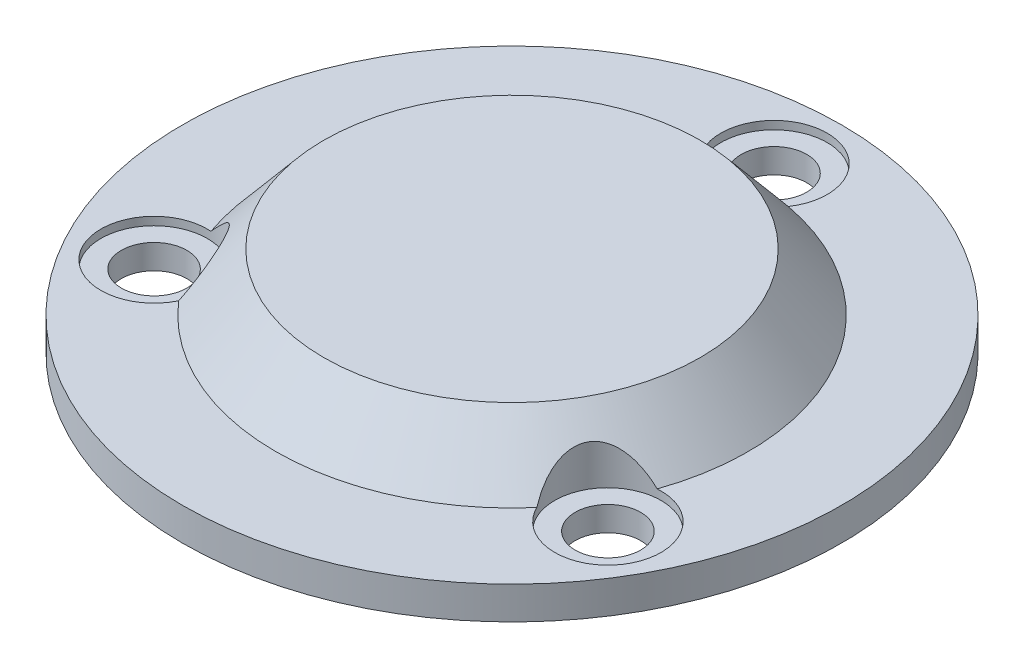
ISO-10303-21;
HEADER;
FILE_DESCRIPTION(('STEP AP214'),'2;1');
FILE_NAME('part.step','',(''),(''),'','','');
FILE_SCHEMA(('AUTOMOTIVE_DESIGN { 1 0 10303 214 1 1 1 1 }'));
ENDSEC;
DATA;
#1=APPLICATION_CONTEXT('core data for automotive mechanical design processes');
#2=APPLICATION_PROTOCOL_DEFINITION('international standard','automotive_design',2000,#1);
#3=PRODUCT_CONTEXT('',#1,'mechanical');
#4=PRODUCT('Part','Part','',(#3));
#5=PRODUCT_RELATED_PRODUCT_CATEGORY('part','',(#4));
#6=PRODUCT_DEFINITION_FORMATION('','',#4);
#7=PRODUCT_DEFINITION_CONTEXT('part definition',#1,'design');
#8=PRODUCT_DEFINITION('design','',#6,#7);
#9=PRODUCT_DEFINITION_SHAPE('','',#8);
#10=(LENGTH_UNIT() NAMED_UNIT(*) SI_UNIT(.MILLI.,.METRE.));
#11=(NAMED_UNIT(*) PLANE_ANGLE_UNIT() SI_UNIT($,.RADIAN.));
#12=(NAMED_UNIT(*) SI_UNIT($,.STERADIAN.) SOLID_ANGLE_UNIT());
#13=UNCERTAINTY_MEASURE_WITH_UNIT(LENGTH_MEASURE(1.E-05),#10,'distance_accuracy_value','');
#14=(GEOMETRIC_REPRESENTATION_CONTEXT(3) GLOBAL_UNCERTAINTY_ASSIGNED_CONTEXT((#13)) GLOBAL_UNIT_ASSIGNED_CONTEXT((#10,
#11,#12)) REPRESENTATION_CONTEXT('',''));
#15=CARTESIAN_POINT('',(0.,0.,0.));
#16=DIRECTION('',(0.,0.,1.));
#17=DIRECTION('',(1.,0.,0.));
#18=AXIS2_PLACEMENT_3D('',#15,#16,#17);
#19=CARTESIAN_POINT('',(0.,4.,0.));
#20=DIRECTION('',(0.,-1.,0.));
#21=DIRECTION('',(0.,0.,-1.));
#22=AXIS2_PLACEMENT_3D('',#19,#20,#21);
#23=CONICAL_SURFACE('',#22,22.9915332143791,0.698131700797729);
#24=CARTESIAN_POINT('',(0.,4.,0.));
#25=DIRECTION('',(0.,1.,0.));
#26=DIRECTION('',(0.,0.,1.));
#27=AXIS2_PLACEMENT_3D('',#24,#25,#26);
#28=CIRCLE('',#27,22.9915332143791);
#29=CARTESIAN_POINT('',(0.,4.,22.9915332143791));
#30=VERTEX_POINT('',#29);
#31=EDGE_CURVE('E80',#30,#30,#28,.T.);
#32=ORIENTED_EDGE('',*,*,#31,.F.);
#33=EDGE_LOOP('',(#32));
#34=FACE_BOUND('',#33,.T.);
#35=CARTESIAN_POINT('',(0.,-3.,0.));
#36=DIRECTION('',(0.,1.,0.));
#37=DIRECTION('',(0.,0.,1.));
#38=AXIS2_PLACEMENT_3D('',#35,#36,#37);
#39=CIRCLE('',#38,28.86523063262);
#40=CARTESIAN_POINT('',(-5.38426742507665,-3.,-28.3586178042866));
#41=VERTEX_POINT('',#40);
#42=CARTESIAN_POINT('',(-27.2514171472639,-3.,9.51639653125897));
#43=VERTEX_POINT('',#42);
#44=EDGE_CURVE('E71',#41,#43,#39,.T.);
#45=ORIENTED_EDGE('',*,*,#44,.T.);
#46=CARTESIAN_POINT('',(-28.3674083101256,-4.26464020688512,9.53304516200623));
#47=CARTESIAN_POINT('',(-28.276426053048,-4.15836582774383,9.52383802411035));
#48=CARTESIAN_POINT('',(-28.1849933470045,-4.05232236374394,9.51652030555505));
#49=CARTESIAN_POINT('',(-28.0012473833018,-3.84079081320335,9.50575011669946));
#50=CARTESIAN_POINT('',(-27.9089340631355,-3.73530276692426,9.50229792286963));
#51=CARTESIAN_POINT('',(-27.6296522186227,-3.41862031211702,9.49785379660031));
#52=CARTESIAN_POINT('',(-27.4413932919554,-3.20843752160533,9.50288294127843));
#53=CARTESIAN_POINT('',(-27.0667360681301,-2.79737210180176,9.5295334610195));
#54=CARTESIAN_POINT('',(-26.8804164844017,-2.59638971636689,9.55072040681778));
#55=CARTESIAN_POINT('',(-26.5050720084076,-2.1993790284019,9.61036065087066));
#56=CARTESIAN_POINT('',(-26.3160461464195,-2.00335257500208,9.64882029624996));
#57=CARTESIAN_POINT('',(-25.9361603611839,-1.61857214312343,9.74445888213441));
#58=CARTESIAN_POINT('',(-25.7453055766227,-1.42980266306422,9.8015951222856));
#59=CARTESIAN_POINT('',(-25.3620249649312,-1.06165836102233,9.93658096225799));
#60=CARTESIAN_POINT('',(-25.169600310559,-0.882277157192325,10.0144162667721));
#61=CARTESIAN_POINT('',(-24.7660225672919,-0.520102071360129,10.2016851304389));
#62=CARTESIAN_POINT('',(-24.5547905274695,-0.338539666160835,10.3133826352236));
#63=CARTESIAN_POINT('',(-24.1336564883917,0.00282684032135299,10.5685949873295));
#64=CARTESIAN_POINT('',(-23.9237537332971,0.162644612734362,10.7120896927537));
#65=CARTESIAN_POINT('',(-23.5411155577227,0.429015681360531,11.0103638945396));
#66=CARTESIAN_POINT('',(-23.3675820885006,0.539973062170191,11.1601091075028));
#67=CARTESIAN_POINT('',(-23.0293404687854,0.731489268579568,11.486681930907));
#68=CARTESIAN_POINT('',(-22.8646180467184,0.81209861317097,11.6634638383838));
#69=CARTESIAN_POINT('',(-22.5785611977636,0.923920891687245,12.0087109387845));
#70=CARTESIAN_POINT('',(-22.4547227232866,0.961372292830999,12.173055526795));
#71=CARTESIAN_POINT('',(-22.2217330145777,1.00692818740182,12.5156284354428));
#72=CARTESIAN_POINT('',(-22.1125720441243,1.0150522283196,12.6938474274424));
#73=CARTESIAN_POINT('',(-21.9124314335811,1.00115476983224,13.0590884856182));
#74=CARTESIAN_POINT('',(-21.8214537632654,0.979130006471208,13.246111502815));
#75=CARTESIAN_POINT('',(-21.659402819934,0.907092870982539,13.6233439314914));
#76=CARTESIAN_POINT('',(-21.5883453707507,0.85705834302277,13.8135557496404));
#77=CARTESIAN_POINT('',(-21.4474387517323,0.714201277627367,14.2500150323543));
#78=CARTESIAN_POINT('',(-21.3845187945461,0.612996555381667,14.495725360572));
#79=CARTESIAN_POINT('',(-21.2888583231161,0.379926367412418,14.9783779946829));
#80=CARTESIAN_POINT('',(-21.2561857217223,0.247992734197573,15.2152994288881));
#81=CARTESIAN_POINT('',(-21.2212848549463,-0.00458105832007092,15.6235803714685));
#82=CARTESIAN_POINT('',(-21.2137431487851,-0.120710874185286,15.7973721652305));
#83=CARTESIAN_POINT('',(-21.2120439392642,-0.363138681185438,16.137879214392));
#84=CARTESIAN_POINT('',(-21.2178942406565,-0.489442560295005,16.3045902855352));
#85=CARTESIAN_POINT('',(-21.2414427346962,-0.750050157074835,16.6310127612756));
#86=CARTESIAN_POINT('',(-21.2591547691989,-0.884363053736567,16.7907157556508));
#87=CARTESIAN_POINT('',(-21.3051469553955,-1.1591105358588,17.1030482081892));
#88=CARTESIAN_POINT('',(-21.3334249188559,-1.29954384844805,17.2556791236481));
#89=CARTESIAN_POINT('',(-21.4238799585214,-1.69069472150074,17.6643274481484));
#90=CARTESIAN_POINT('',(-21.4956761249397,-1.94635265120118,17.9135607721145));
#91=CARTESIAN_POINT('',(-21.6217564795988,-2.33684924212505,18.2726782156673));
#92=CARTESIAN_POINT('',(-21.6668312288329,-2.46814234506328,18.3898954268336));
#93=CARTESIAN_POINT('',(-21.7627704204398,-2.73275057942776,18.6196358450838));
#94=CARTESIAN_POINT('',(-21.8136356310286,-2.86606597711195,18.7321584266226));
#95=CARTESIAN_POINT('',(-21.994805954503,-3.3194955231395,19.1047728206892));
#96=CARTESIAN_POINT('',(-22.1378447217794,-3.64342970979444,19.354153432532));
#97=CARTESIAN_POINT('',(-22.4516089316416,-4.29675627597287,19.8275853736476));
#98=CARTESIAN_POINT('',(-22.6223607563035,-4.6261535853,20.0516122184641));
#99=CARTESIAN_POINT('',(-22.8975187393052,-5.12201492656997,20.3683507089587));
#100=CARTESIAN_POINT('',(-22.9924474771553,-5.28765637488683,20.4707467130131));
#101=CARTESIAN_POINT('',(-23.1884505429334,-5.61923448278426,20.669002052432));
#102=CARTESIAN_POINT('',(-23.2895249354063,-5.78517114544755,20.7648613191218));
#103=CARTESIAN_POINT('',(-23.4974476736313,-6.11675998061294,20.9497498594328));
#104=CARTESIAN_POINT('',(-23.6042861823071,-6.28241216925348,21.0387901787568));
#105=CARTESIAN_POINT('',(-23.8237274452137,-6.6134301663002,21.2100243315079));
#106=CARTESIAN_POINT('',(-23.9363300709475,-6.7787959810055,21.2922183174503));
#107=CARTESIAN_POINT('',(-24.0517359881804,-6.94388398042572,21.370895241136));
#108=B_SPLINE_CURVE_WITH_KNOTS('',3,(#46,#47,#48,#49,#50,#51,#52,#53,#54,#55,#56,#57,#58,#59,
#60,#61,#62,#63,#64,#65,#66,#67,#68,#69,#70,#71,#72,#73,#74,#75,#76,#77,#78,#79,#80,#81,#82,#83,
#84,#85,#86,#87,#88,#89,#90,#91,#92,#93,#94,#95,#96,#97,#98,#99,#100,#101,#102,#103,#104,#105,
#106,#107),.UNSPECIFIED.,.F.,.F.,(4,2,2,2,2,2,2,2,2,2,2,2,2,2,2,2,2,2,2,2,2,2,2,2,2,2,2,2,2,2,
4),(0.,0.420579236896307,0.841188552584911,1.6872652068447,2.51136236366432,3.33576259601512,
4.15829103076403,4.98025287482022,5.87858544890424,6.77635059382469,7.53759505637354,
8.29756664724598,8.92226576968056,9.54654843604196,10.1708986935504,10.7957435137749,
11.6104715098323,12.4270243679679,13.0536595571663,13.6806600371856,14.3083934630372,
14.9359969555398,16.0265338708143,16.5714732649629,17.1164850402306,18.4138428332383,
19.7124429988806,20.3622123015474,21.0119884296246,21.6606887167509,22.3093745489699),.UNSPECIFIED.);
#109=CARTESIAN_POINT('',(-21.8671497221859,-3.,18.8422212730307));
#110=VERTEX_POINT('',#109);
#111=EDGE_CURVE('E47',#43,#110,#108,.T.);
#112=ORIENTED_EDGE('',*,*,#111,.T.);
#113=CARTESIAN_POINT('',(21.8671497221893,-3.,18.8422212730268));
#114=VERTEX_POINT('',#113);
#115=EDGE_CURVE('E53',#110,#114,#39,.T.);
#116=ORIENTED_EDGE('',*,*,#115,.T.);
#117=CARTESIAN_POINT('',(21.8672296337352,-3.0002,18.8423856231038));
#118=CARTESIAN_POINT('',(21.8270913440078,-2.89974130950503,18.7598310930137));
#119=CARTESIAN_POINT('',(21.7884815558693,-2.79973901030024,18.6759880149452));
#120=CARTESIAN_POINT('',(21.714453830877,-2.60078646677593,18.5056576991601));
#121=CARTESIAN_POINT('',(21.6790363289353,-2.50183636742135,18.4191701033015));
#122=CARTESIAN_POINT('',(21.577620524894,-2.2063192768177,18.1552321063944));
#123=CARTESIAN_POINT('',(21.5166624031246,-2.01159268047443,17.9737214183943));
#124=CARTESIAN_POINT('',(21.408968119518,-1.62630643849747,17.5970101728006));
#125=CARTESIAN_POINT('',(21.3624321950427,-1.4358368369589,17.4016594782976));
#126=CARTESIAN_POINT('',(21.2868034383069,-1.06451708742264,16.9991431562968));
#127=CARTESIAN_POINT('',(21.2576897936195,-0.883655697992276,16.7919919509775));
#128=CARTESIAN_POINT('',(21.2179055796186,-0.519880732578358,16.346891215484));
#129=CARTESIAN_POINT('',(21.2090257546884,-0.338115110943773,16.1078229600718));
#130=CARTESIAN_POINT('',(21.2195452531679,0.00319953167335281,15.6154704471332));
#131=CARTESIAN_POINT('',(21.2388609964301,0.162812685038377,15.3622303368299));
#132=CARTESIAN_POINT('',(21.3058083990478,0.428999105248091,14.8820521587844));
#133=CARTESIAN_POINT('',(21.3487173606523,0.539942980839153,14.65692628124));
#134=CARTESIAN_POINT('',(21.46240946479,0.731467397235801,14.2007154838077));
#135=CARTESIAN_POINT('',(21.5331534365006,0.812090296749569,13.9696393626251));
#136=CARTESIAN_POINT('',(21.6891279026916,0.923919881238081,13.5492559541044));
#137=CARTESIAN_POINT('',(21.7695334009076,0.961370775732655,13.3598402783779));
#138=CARTESIAN_POINT('',(21.9497146074759,1.00692784215383,12.9867785973363));
#139=CARTESIAN_POINT('',(22.0494781588601,1.0150523687605,12.8031290545181));
#140=CARTESIAN_POINT('',(22.2657202307679,1.00115463401148,12.4471745208173));
#141=CARTESIAN_POINT('',(22.3822005487034,0.979129128701766,12.2748707527596));
#142=CARTESIAN_POINT('',(22.6278684377422,0.907090901867632,11.9459149190957));
#143=CARTESIAN_POINT('',(22.7570655080687,0.857057125803524,11.7892747327383));
#144=CARTESIAN_POINT('',(23.0646119254976,0.714193131712037,11.4489998999705));
#145=CARTESIAN_POINT('',(23.2459623502563,0.612976153740385,11.2716381027356));
#146=CARTESIAN_POINT('',(23.6161232037385,0.379899693344707,10.947473442239));
#147=CARTESIAN_POINT('',(23.8049480836104,0.247978177896749,10.800733598885));
#148=CARTESIAN_POINT('',(24.1409115060021,-0.00446954360105325,10.5664850768973));
#149=CARTESIAN_POINT('',(24.2874985504376,-0.120474590707647,10.4731445333457));
#150=CARTESIAN_POINT('',(24.5812384071822,-0.362636619170545,10.30156223337));
#151=CARTESIAN_POINT('',(24.7283915016201,-0.488799533290529,10.2233293926718));
#152=CARTESIAN_POINT('',(25.0228566505415,-0.749375200784125,10.0804559158921));
#153=CARTESIAN_POINT('',(25.1701676994535,-0.883813131914345,10.015859708889));
#154=CARTESIAN_POINT('',(25.4639610284776,-1.15883408806517,9.89937486482266));
#155=CARTESIAN_POINT('',(25.6104434953879,-1.29941566015241,9.84748324216464));
#156=CARTESIAN_POINT('',(25.8836766041887,-1.56719809391071,9.76124382916904));
#157=CARTESIAN_POINT('',(26.0105617822509,-1.69381964668561,9.72550275950733));
#158=CARTESIAN_POINT('',(26.263342074356,-1.95009221835616,9.66233451845889));
#159=CARTESIAN_POINT('',(26.3892371387537,-2.07974338788144,9.63490776140316));
#160=CARTESIAN_POINT('',(26.6385854029632,-2.3401205423786,9.58813873079076));
#161=CARTESIAN_POINT('',(26.7620503457176,-2.47082064751491,9.56871400209318));
#162=CARTESIAN_POINT('',(27.0077547433416,-2.73415529834523,9.53716882471472));
#163=CARTESIAN_POINT('',(27.1299946187311,-2.86678913900374,9.52504577885422));
#164=CARTESIAN_POINT('',(27.2515994343794,-3.0002,9.5163835616472));
#165=B_SPLINE_CURVE_WITH_KNOTS('',3,(#117,#118,#119,#120,#121,#122,#123,#124,#125,#126,#127,
#128,#129,#130,#131,#132,#133,#134,#135,#136,#137,#138,#139,#140,#141,#142,#143,#144,#145,#146,
#147,#148,#149,#150,#151,#152,#153,#154,#155,#156,#157,#158,#159,#160,#161,#162,#163,#164),
.UNSPECIFIED.,.F.,.F.,(4,2,2,2,2,2,2,2,2,2,2,2,2,2,2,2,2,2,2,2,2,2,2,4),(0.,0.408214964738593,
0.816485460268306,1.63508109552709,2.46457967657664,3.29308536110057,4.19246483547199,
5.08918368653363,5.85032532785218,6.61039966155916,7.23508607661022,7.85938144735025,
8.48374399362987,9.10857652084355,9.92338656803001,10.7398573058782,11.365856115756,
11.9922232338446,12.6206006340818,13.2488302227168,13.79695997138,14.3451170307581,
14.8874752197241,15.4296403799293),.UNSPECIFIED.);
#166=CARTESIAN_POINT('',(27.2514171472646,-3.,9.51639653125685));
#167=VERTEX_POINT('',#166);
#168=EDGE_CURVE('E98',#114,#167,#165,.T.);
#169=ORIENTED_EDGE('',*,*,#168,.T.);
#170=CARTESIAN_POINT('',(5.38426742507665,-3.,-28.3586178042866));
#171=VERTEX_POINT('',#170);
#172=EDGE_CURVE('E78',#167,#171,#39,.T.);
#173=ORIENTED_EDGE('',*,*,#172,.T.);
#174=CARTESIAN_POINT('',(5.3843698006455,-3.0002,-28.358769184754));
#175=CARTESIAN_POINT('',(5.33294462525366,-2.89974130950503,-28.2827311411405));
#176=CARTESIAN_POINT('',(5.27963928378408,-2.79973901030024,-28.2073725447436));
#177=CARTESIAN_POINT('',(5.16914276577578,-2.60078646677591,-28.0580974964233));
#178=CARTESIAN_POINT('',(5.11195106162087,-2.50183636742133,-27.984181242074));
#179=CARTESIAN_POINT('',(4.93408195329601,-2.20631927681767,-27.7643835809754));
#180=CARTESIAN_POINT('',(4.8073681473143,-2.01159268047438,-27.6208369549561));
#181=CARTESIAN_POINT('',(4.53497378054225,-1.62630643849739,-27.3392153467136));
#182=CARTESIAN_POINT('',(4.38906307869342,-1.4358368369588,-27.2012387066779));
#183=CARTESIAN_POINT('',(4.07828809677082,-1.0645170874225,-26.9344841210876));
#184=CARTESIAN_POINT('',(3.91344671288341,-0.883655697992117,-26.8056953625319));
#185=CARTESIAN_POINT('',(3.54787027570339,-0.519880732578081,-26.5486908547906));
#186=CARTESIAN_POINT('',(3.3452710057431,-0.338115110943406,-26.4214665731138));
#187=CARTESIAN_POINT('',(2.91362147268135,0.00319953167389733,-26.1844004695627));
#188=CARTESIAN_POINT('',(2.68465123227045,0.16281268503901,-26.0745083387691));
#189=CARTESIAN_POINT('',(2.23533103043122,0.428999105248885,-25.8923974011306));
#190=CARTESIAN_POINT('',(2.01891182062619,0.53994298084002,-25.8169947131578));
#191=CARTESIAN_POINT('',(1.56697562850024,0.731467397236809,-25.6873495648346));
#192=CARTESIAN_POINT('',(1.33148585149274,0.812090296750645,-25.6330775809092));
#193=CARTESIAN_POINT('',(0.889435907288843,0.923919881239272,-25.5579637267119));
#194=CARTESIAN_POINT('',(0.685194371126686,0.961370775733898,-25.5328890929077));
#195=CARTESIAN_POINT('',(0.272022874881985,1.00692784215517,-25.5023997545595));
#196=CARTESIAN_POINT('',(0.0630959297158933,1.01505236876189,-25.4969727530208));
#197=CARTESIAN_POINT('',(-0.35329077501513,1.00115463401295,-25.5062666138096));
#198=CARTESIAN_POINT('',(-0.560750374288697,0.979129128703291,-25.5209896441537));
#199=CARTESIAN_POINT('',(-0.968468427484161,0.907090901869239,-25.5692663601234));
#200=CARTESIAN_POINT('',(-1.16872134328647,0.857057125805165,-25.602834211942));
#201=CARTESIAN_POINT('',(-1.61718120144633,0.714193131713773,-25.6990398058944));
#202=CARTESIAN_POINT('',(-1.86145623589189,0.612976153742192,-25.7674129821051));
#203=CARTESIAN_POINT('',(-2.3272714936322,0.379899693346648,-25.9258993544588));
#204=CARTESIAN_POINT('',(-2.54876436566001,0.247978177898754,-26.0160565756174));
#205=CARTESIAN_POINT('',(-2.91961124769614,-0.00446954359892481,-26.1898851731571));
#206=CARTESIAN_POINT('',(-3.07374005183261,-0.120474590705458,-26.270163005728));
#207=CARTESIAN_POINT('',(-3.36920461082352,-0.36263661916823,-26.4387580337849));
#208=CARTESIAN_POINT('',(-3.51053278549731,-0.488799533288149,-26.5270799314645));
#209=CARTESIAN_POINT('',(-3.78149742037624,-0.749375200781619,-26.7106574925697));
#210=CARTESIAN_POINT('',(-3.91109490108504,-0.883813131911779,-26.805934499684));
#211=CARTESIAN_POINT('',(-4.15887039971439,-1.15883408806248,-27.002124564048));
#212=CARTESIAN_POINT('',(-4.27705109663495,-1.29941566014965,-27.1030362902723));
#213=CARTESIAN_POINT('',(-4.48835317349721,-1.56719809390811,-27.2965433971511));
#214=CARTESIAN_POINT('',(-4.58274843681396,-1.69381964668323,-27.388558649886));
#215=CARTESIAN_POINT('',(-4.76384388432719,-1.95009221835424,-27.5758886839012));
#216=CARTESIAN_POINT('',(-4.85054368487991,-2.07974338787976,-27.671203629353));
#217=CARTESIAN_POINT('',(-5.01572098560564,-2.34012054237739,-27.8637610452421));
#218=CARTESIAN_POINT('',(-5.09427576549668,-2.47082064751393,-27.9609724577956));
#219=CARTESIAN_POINT('',(-5.24444688928558,-2.73415529834474,-28.1579861192707));
#220=CARTESIAN_POINT('',(-5.31606569266688,-2.86678913900349,-28.2577874337834));
#221=CARTESIAN_POINT('',(-5.3843698006455,-3.0002,-28.358769184754));
#222=B_SPLINE_CURVE_WITH_KNOTS('',3,(#174,#175,#176,#177,#178,#179,#180,#181,#182,#183,#184,
#185,#186,#187,#188,#189,#190,#191,#192,#193,#194,#195,#196,#197,#198,#199,#200,#201,#202,#203,
#204,#205,#206,#207,#208,#209,#210,#211,#212,#213,#214,#215,#216,#217,#218,#219,#220,#221),
.UNSPECIFIED.,.F.,.F.,(4,2,2,2,2,2,2,2,2,2,2,2,2,2,2,2,2,2,2,2,2,2,2,4),(0.,0.408214964738593,
0.816485460268306,1.63508109552708,2.46457967657662,3.29308536110055,4.19246483547222,
5.08918368653411,5.85032532785284,6.61039966156,7.23508607661108,7.85938144735114,
8.48374399363079,9.10857652084452,9.92338656803079,10.7398573058788,11.3658561157564,
11.9922232338448,12.6206006340818,13.2488302227166,13.7969599713808,14.3451170307599,
14.8874752197269,15.429640379933),.UNSPECIFIED.);
#223=EDGE_CURVE('E91',#171,#41,#222,.T.);
#224=ORIENTED_EDGE('',*,*,#223,.T.);
#225=EDGE_LOOP('',(#45,#112,#116,#169,#173,#224));
#226=FACE_BOUND('',#225,.T.);
#227=ADVANCED_FACE('F33',(#34,#226),#23,.T.);
#228=CARTESIAN_POINT('',(-28.86523063262,-3.,0.));
#229=DIRECTION('',(0.,1.,0.));
#230=DIRECTION('',(0.,0.,1.));
#231=AXIS2_PLACEMENT_3D('',#228,#229,#230);
#232=PLANE('',#231);
#233=CARTESIAN_POINT('',(0.,-3.,0.));
#234=DIRECTION('',(0.,1.,0.));
#235=DIRECTION('',(0.,0.,1.));
#236=AXIS2_PLACEMENT_3D('',#233,#234,#235);
#237=CIRCLE('',#236,40.25);
#238=CARTESIAN_POINT('',(0.,-3.,40.25));
#239=VERTEX_POINT('',#238);
#240=EDGE_CURVE('E81',#239,#239,#237,.T.);
#241=ORIENTED_EDGE('',*,*,#240,.T.);
#242=EDGE_LOOP('',(#241));
#243=FACE_BOUND('',#242,.T.);
#244=ORIENTED_EDGE('',*,*,#115,.F.);
#245=CARTESIAN_POINT('',(-27.7128129211,-3.,16.0000000000012));
#246=DIRECTION('',(0.,1.,0.));
#247=DIRECTION('',(0.,0.,1.));
#248=AXIS2_PLACEMENT_3D('',#245,#246,#247);
#249=CIRCLE('',#248,6.5);
#250=EDGE_CURVE('E11',#110,#43,#249,.F.);
#251=ORIENTED_EDGE('',*,*,#250,.T.);
#252=ORIENTED_EDGE('',*,*,#44,.F.);
#253=CARTESIAN_POINT('',(0.,-3.,-32.));
#254=DIRECTION('',(0.,1.,0.));
#255=DIRECTION('',(0.,0.,1.));
#256=AXIS2_PLACEMENT_3D('',#253,#254,#255);
#257=CIRCLE('',#256,6.5);
#258=EDGE_CURVE('E87',#41,#171,#257,.F.);
#259=ORIENTED_EDGE('',*,*,#258,.T.);
#260=ORIENTED_EDGE('',*,*,#172,.F.);
#261=CARTESIAN_POINT('',(27.7128129211041,-3.,15.9999999999988));
#262=DIRECTION('',(0.,1.,0.));
#263=DIRECTION('',(0.,0.,1.));
#264=AXIS2_PLACEMENT_3D('',#261,#262,#263);
#265=CIRCLE('',#264,6.5);
#266=EDGE_CURVE('E41',#167,#114,#265,.F.);
#267=ORIENTED_EDGE('',*,*,#266,.T.);
#268=EDGE_LOOP('',(#244,#251,#252,#259,#260,#267));
#269=FACE_BOUND('',#268,.T.);
#270=ADVANCED_FACE('F76',(#243,#269),#232,.T.);
#271=CARTESIAN_POINT('',(-27.7128129211,-7.,16.0000000000012));
#272=DIRECTION('',(0.,1.,0.));
#273=DIRECTION('',(0.,0.,1.));
#274=AXIS2_PLACEMENT_3D('',#271,#272,#273);
#275=CYLINDRICAL_SURFACE('',#274,4.00000000000259);
#276=CARTESIAN_POINT('',(-27.7128129211,-7.,16.0000000000012));
#277=DIRECTION('',(0.,1.,0.));
#278=DIRECTION('',(0.,0.,1.));
#279=AXIS2_PLACEMENT_3D('',#276,#277,#278);
#280=CIRCLE('',#279,4.00000000000259);
#281=CARTESIAN_POINT('',(-27.7128129211,-7.,20.0000000000038));
#282=VERTEX_POINT('',#281);
#283=EDGE_CURVE('E143',#282,#282,#280,.T.);
#284=ORIENTED_EDGE('',*,*,#283,.F.);
#285=EDGE_LOOP('',(#284));
#286=FACE_BOUND('',#285,.T.);
#287=CARTESIAN_POINT('',(-27.7128129211,-4.,16.0000000000012));
#288=DIRECTION('',(0.,1.,0.));
#289=DIRECTION('',(0.,0.,1.));
#290=AXIS2_PLACEMENT_3D('',#287,#288,#289);
#291=CIRCLE('',#290,4.00000000000259);
#292=CARTESIAN_POINT('',(-27.7128129211,-4.,20.0000000000038));
#293=VERTEX_POINT('',#292);
#294=EDGE_CURVE('E73',#293,#293,#291,.F.);
#295=ORIENTED_EDGE('',*,*,#294,.F.);
#296=EDGE_LOOP('',(#295));
#297=FACE_BOUND('',#296,.T.);
#298=ADVANCED_FACE('F149',(#286,#297),#275,.F.);
#299=CARTESIAN_POINT('',(27.7128129211041,-7.,15.9999999999988));
#300=DIRECTION('',(0.,1.,0.));
#301=DIRECTION('',(0.,0.,1.));
#302=AXIS2_PLACEMENT_3D('',#299,#300,#301);
#303=CYLINDRICAL_SURFACE('',#302,4.00000000000176);
#304=CARTESIAN_POINT('',(27.7128129211041,-7.,15.9999999999988));
#305=DIRECTION('',(0.,1.,0.));
#306=DIRECTION('',(0.,0.,1.));
#307=AXIS2_PLACEMENT_3D('',#304,#305,#306);
#308=CIRCLE('',#307,4.00000000000176);
#309=CARTESIAN_POINT('',(27.7128129211041,-7.,20.0000000000006));
#310=VERTEX_POINT('',#309);
#311=EDGE_CURVE('E194',#310,#310,#308,.T.);
#312=ORIENTED_EDGE('',*,*,#311,.F.);
#313=EDGE_LOOP('',(#312));
#314=FACE_BOUND('',#313,.T.);
#315=CARTESIAN_POINT('',(27.7128129211041,-4.,15.9999999999988));
#316=DIRECTION('',(0.,1.,0.));
#317=DIRECTION('',(0.,0.,1.));
#318=AXIS2_PLACEMENT_3D('',#315,#316,#317);
#319=CIRCLE('',#318,4.00000000000176);
#320=CARTESIAN_POINT('',(27.7128129211041,-4.,20.0000000000006));
#321=VERTEX_POINT('',#320);
#322=EDGE_CURVE('E95',#321,#321,#319,.F.);
#323=ORIENTED_EDGE('',*,*,#322,.F.);
#324=EDGE_LOOP('',(#323));
#325=FACE_BOUND('',#324,.T.);
#326=ADVANCED_FACE('F152',(#314,#325),#303,.F.);
#327=CARTESIAN_POINT('',(0.,-7.,-32.));
#328=DIRECTION('',(0.,1.,0.));
#329=DIRECTION('',(0.,0.,1.));
#330=AXIS2_PLACEMENT_3D('',#327,#328,#329);
#331=CYLINDRICAL_SURFACE('',#330,4.);
#332=CARTESIAN_POINT('',(0.,-7.,-32.));
#333=DIRECTION('',(0.,1.,0.));
#334=DIRECTION('',(0.,0.,1.));
#335=AXIS2_PLACEMENT_3D('',#332,#333,#334);
#336=CIRCLE('',#335,4.);
#337=CARTESIAN_POINT('',(0.,-7.,-28.));
#338=VERTEX_POINT('',#337);
#339=EDGE_CURVE('E192',#338,#338,#336,.T.);
#340=ORIENTED_EDGE('',*,*,#339,.F.);
#341=EDGE_LOOP('',(#340));
#342=FACE_BOUND('',#341,.T.);
#343=CARTESIAN_POINT('',(0.,-4.,-32.));
#344=DIRECTION('',(0.,1.,0.));
#345=DIRECTION('',(0.,0.,1.));
#346=AXIS2_PLACEMENT_3D('',#343,#344,#345);
#347=CIRCLE('',#346,4.);
#348=CARTESIAN_POINT('',(0.,-4.,-28.));
#349=VERTEX_POINT('',#348);
#350=EDGE_CURVE('E88',#349,#349,#347,.F.);
#351=ORIENTED_EDGE('',*,*,#350,.F.);
#352=EDGE_LOOP('',(#351));
#353=FACE_BOUND('',#352,.T.);
#354=ADVANCED_FACE('F156',(#342,#353),#331,.F.);
#355=CARTESIAN_POINT('',(-21.1263025817591,0.,0.));
#356=DIRECTION('',(0.,-1.,0.));
#357=DIRECTION('',(0.,0.,-1.));
#358=AXIS2_PLACEMENT_3D('',#355,#356,#357);
#359=PLANE('',#358);
#360=CARTESIAN_POINT('',(0.,0.,0.));
#361=DIRECTION('',(0.,1.,0.));
#362=DIRECTION('',(0.,0.,1.));
#363=AXIS2_PLACEMENT_3D('',#360,#361,#362);
#364=CIRCLE('',#363,21.1263025817591);
#365=CARTESIAN_POINT('',(0.,0.,21.1263025817591));
#366=VERTEX_POINT('',#365);
#367=EDGE_CURVE('E187',#366,#366,#364,.T.);
#368=ORIENTED_EDGE('',*,*,#367,.F.);
#369=EDGE_LOOP('',(#368));
#370=FACE_BOUND('',#369,.T.);
#371=ADVANCED_FACE('F35',(#370),#359,.T.);
#372=CARTESIAN_POINT('',(0.,4.,0.));
#373=DIRECTION('',(0.,1.,0.));
#374=DIRECTION('',(0.,0.,1.));
#375=AXIS2_PLACEMENT_3D('',#372,#373,#374);
#376=PLANE('',#375);
#377=ORIENTED_EDGE('',*,*,#31,.T.);
#378=EDGE_LOOP('',(#377));
#379=FACE_BOUND('',#378,.T.);
#380=ADVANCED_FACE('F171',(#379),#376,.T.);
#381=CARTESIAN_POINT('',(0.,4.00000000000001,0.));
#382=DIRECTION('',(0.,1.,0.));
#383=DIRECTION('',(0.,0.,1.));
#384=AXIS2_PLACEMENT_3D('',#381,#382,#383);
#385=CYLINDRICAL_SURFACE('',#384,40.25);
#386=CARTESIAN_POINT('',(0.,-7.,0.));
#387=DIRECTION('',(0.,1.,0.));
#388=DIRECTION('',(0.,0.,1.));
#389=AXIS2_PLACEMENT_3D('',#386,#387,#388);
#390=CIRCLE('',#389,40.25);
#391=CARTESIAN_POINT('',(0.,-7.,40.25));
#392=VERTEX_POINT('',#391);
#393=EDGE_CURVE('E182',#392,#392,#390,.T.);
#394=ORIENTED_EDGE('',*,*,#393,.T.);
#395=EDGE_LOOP('',(#394));
#396=FACE_BOUND('',#395,.T.);
#397=ORIENTED_EDGE('',*,*,#240,.F.);
#398=EDGE_LOOP('',(#397));
#399=FACE_BOUND('',#398,.T.);
#400=ADVANCED_FACE('F168',(#396,#399),#385,.T.);
#401=CARTESIAN_POINT('',(-40.25,-7.,0.));
#402=DIRECTION('',(0.,-1.,0.));
#403=DIRECTION('',(0.,0.,-1.));
#404=AXIS2_PLACEMENT_3D('',#401,#402,#403);
#405=PLANE('',#404);
#406=ORIENTED_EDGE('',*,*,#283,.T.);
#407=EDGE_LOOP('',(#406));
#408=FACE_BOUND('',#407,.T.);
#409=ORIENTED_EDGE('',*,*,#311,.T.);
#410=EDGE_LOOP('',(#409));
#411=FACE_BOUND('',#410,.T.);
#412=ORIENTED_EDGE('',*,*,#339,.T.);
#413=EDGE_LOOP('',(#412));
#414=FACE_BOUND('',#413,.T.);
#415=CARTESIAN_POINT('',(0.,-7.,0.));
#416=DIRECTION('',(0.,1.,0.));
#417=DIRECTION('',(0.,0.,1.));
#418=AXIS2_PLACEMENT_3D('',#415,#416,#417);
#419=CIRCLE('',#418,27.);
#420=CARTESIAN_POINT('',(0.,-7.,27.));
#421=VERTEX_POINT('',#420);
#422=EDGE_CURVE('E184',#421,#421,#419,.T.);
#423=ORIENTED_EDGE('',*,*,#422,.T.);
#424=EDGE_LOOP('',(#423));
#425=FACE_BOUND('',#424,.T.);
#426=ORIENTED_EDGE('',*,*,#393,.F.);
#427=EDGE_LOOP('',(#426));
#428=FACE_BOUND('',#427,.T.);
#429=ADVANCED_FACE('F164',(#408,#411,#414,#425,#428),#405,.T.);
#430=CARTESIAN_POINT('',(0.,-7.,0.));
#431=DIRECTION('',(0.,-1.,0.));
#432=DIRECTION('',(0.,0.,-1.));
#433=AXIS2_PLACEMENT_3D('',#430,#431,#432);
#434=CONICAL_SURFACE('',#433,27.,0.698131700797729);
#435=ORIENTED_EDGE('',*,*,#367,.T.);
#436=EDGE_LOOP('',(#435));
#437=FACE_BOUND('',#436,.T.);
#438=ORIENTED_EDGE('',*,*,#422,.F.);
#439=EDGE_LOOP('',(#438));
#440=FACE_BOUND('',#439,.T.);
#441=ADVANCED_FACE('F161',(#437,#440),#434,.F.);
#442=CARTESIAN_POINT('',(0.,-4.,-32.));
#443=DIRECTION('',(0.,1.,0.));
#444=DIRECTION('',(0.,0.,1.));
#445=AXIS2_PLACEMENT_3D('',#442,#443,#444);
#446=PLANE('',#445);
#447=CARTESIAN_POINT('',(0.,-4.,-32.));
#448=DIRECTION('',(0.,1.,0.));
#449=DIRECTION('',(0.,0.,1.));
#450=AXIS2_PLACEMENT_3D('',#447,#448,#449);
#451=CIRCLE('',#450,6.5);
#452=CARTESIAN_POINT('',(0.,-4.,-25.5));
#453=VERTEX_POINT('',#452);
#454=EDGE_CURVE('E92',#453,#453,#451,.T.);
#455=ORIENTED_EDGE('',*,*,#454,.T.);
#456=EDGE_LOOP('',(#455));
#457=FACE_BOUND('',#456,.T.);
#458=ORIENTED_EDGE('',*,*,#350,.T.);
#459=EDGE_LOOP('',(#458));
#460=FACE_BOUND('',#459,.T.);
#461=ADVANCED_FACE('F131',(#457,#460),#446,.T.);
#462=CARTESIAN_POINT('',(0.,4.,-32.));
#463=DIRECTION('',(0.,-1.,0.));
#464=DIRECTION('',(0.,0.,-1.));
#465=AXIS2_PLACEMENT_3D('',#462,#463,#464);
#466=CYLINDRICAL_SURFACE('',#465,6.5);
#467=ORIENTED_EDGE('',*,*,#258,.F.);
#468=ORIENTED_EDGE('',*,*,#223,.F.);
#469=EDGE_LOOP('',(#467,#468));
#470=FACE_BOUND('',#469,.T.);
#471=ORIENTED_EDGE('',*,*,#454,.F.);
#472=EDGE_LOOP('',(#471));
#473=FACE_BOUND('',#472,.T.);
#474=ADVANCED_FACE('F125',(#470,#473),#466,.F.);
#475=CARTESIAN_POINT('',(27.7128129211041,-4.,15.9999999999988));
#476=DIRECTION('',(0.,1.,0.));
#477=DIRECTION('',(0.,0.,1.));
#478=AXIS2_PLACEMENT_3D('',#475,#476,#477);
#479=PLANE('',#478);
#480=CARTESIAN_POINT('',(27.7128129211041,-4.,15.9999999999988));
#481=DIRECTION('',(0.,1.,0.));
#482=DIRECTION('',(0.,0.,1.));
#483=AXIS2_PLACEMENT_3D('',#480,#481,#482);
#484=CIRCLE('',#483,6.5);
#485=CARTESIAN_POINT('',(27.7128129211041,-4.,22.4999999999988));
#486=VERTEX_POINT('',#485);
#487=EDGE_CURVE('E72',#486,#486,#484,.T.);
#488=ORIENTED_EDGE('',*,*,#487,.T.);
#489=EDGE_LOOP('',(#488));
#490=FACE_BOUND('',#489,.T.);
#491=ORIENTED_EDGE('',*,*,#322,.T.);
#492=EDGE_LOOP('',(#491));
#493=FACE_BOUND('',#492,.T.);
#494=ADVANCED_FACE('F121',(#490,#493),#479,.T.);
#495=CARTESIAN_POINT('',(27.7128129211041,4.,15.9999999999988));
#496=DIRECTION('',(0.,-1.,0.));
#497=DIRECTION('',(0.,0.,-1.));
#498=AXIS2_PLACEMENT_3D('',#495,#496,#497);
#499=CYLINDRICAL_SURFACE('',#498,6.5);
#500=ORIENTED_EDGE('',*,*,#266,.F.);
#501=ORIENTED_EDGE('',*,*,#168,.F.);
#502=EDGE_LOOP('',(#500,#501));
#503=FACE_BOUND('',#502,.T.);
#504=ORIENTED_EDGE('',*,*,#487,.F.);
#505=EDGE_LOOP('',(#504));
#506=FACE_BOUND('',#505,.T.);
#507=ADVANCED_FACE('F124',(#503,#506),#499,.F.);
#508=CARTESIAN_POINT('',(-27.7128129211,-4.,16.0000000000012));
#509=DIRECTION('',(0.,1.,0.));
#510=DIRECTION('',(0.,0.,1.));
#511=AXIS2_PLACEMENT_3D('',#508,#509,#510);
#512=PLANE('',#511);
#513=CARTESIAN_POINT('',(-27.7128129211,-4.,16.0000000000012));
#514=DIRECTION('',(0.,1.,0.));
#515=DIRECTION('',(0.,0.,1.));
#516=AXIS2_PLACEMENT_3D('',#513,#514,#515);
#517=CIRCLE('',#516,6.5);
#518=CARTESIAN_POINT('',(-27.7128129211,-4.,22.5000000000012));
#519=VERTEX_POINT('',#518);
#520=EDGE_CURVE('E100',#519,#519,#517,.T.);
#521=ORIENTED_EDGE('',*,*,#520,.T.);
#522=EDGE_LOOP('',(#521));
#523=FACE_BOUND('',#522,.T.);
#524=ORIENTED_EDGE('',*,*,#294,.T.);
#525=EDGE_LOOP('',(#524));
#526=FACE_BOUND('',#525,.T.);
#527=ADVANCED_FACE('F120',(#523,#526),#512,.T.);
#528=CARTESIAN_POINT('',(-27.7128129211,4.,16.0000000000012));
#529=DIRECTION('',(0.,-1.,0.));
#530=DIRECTION('',(0.,0.,-1.));
#531=AXIS2_PLACEMENT_3D('',#528,#529,#530);
#532=CYLINDRICAL_SURFACE('',#531,6.5);
#533=ORIENTED_EDGE('',*,*,#250,.F.);
#534=ORIENTED_EDGE('',*,*,#111,.F.);
#535=EDGE_LOOP('',(#533,#534));
#536=FACE_BOUND('',#535,.T.);
#537=ORIENTED_EDGE('',*,*,#520,.F.);
#538=EDGE_LOOP('',(#537));
#539=FACE_BOUND('',#538,.T.);
#540=ADVANCED_FACE('F65',(#536,#539),#532,.F.);
#541=CLOSED_SHELL('',(#227,#270,#298,#326,#354,#371,#380,#400,#429,#441,#461,#474,#494,#507,
#527,#540));
#542=MANIFOLD_SOLID_BREP('B2',#541);
#543=ADVANCED_BREP_SHAPE_REPRESENTATION('',(#18,#542),#14);
#544=SHAPE_DEFINITION_REPRESENTATION(#9,#543);
ENDSEC;
END-ISO-10303-21;
